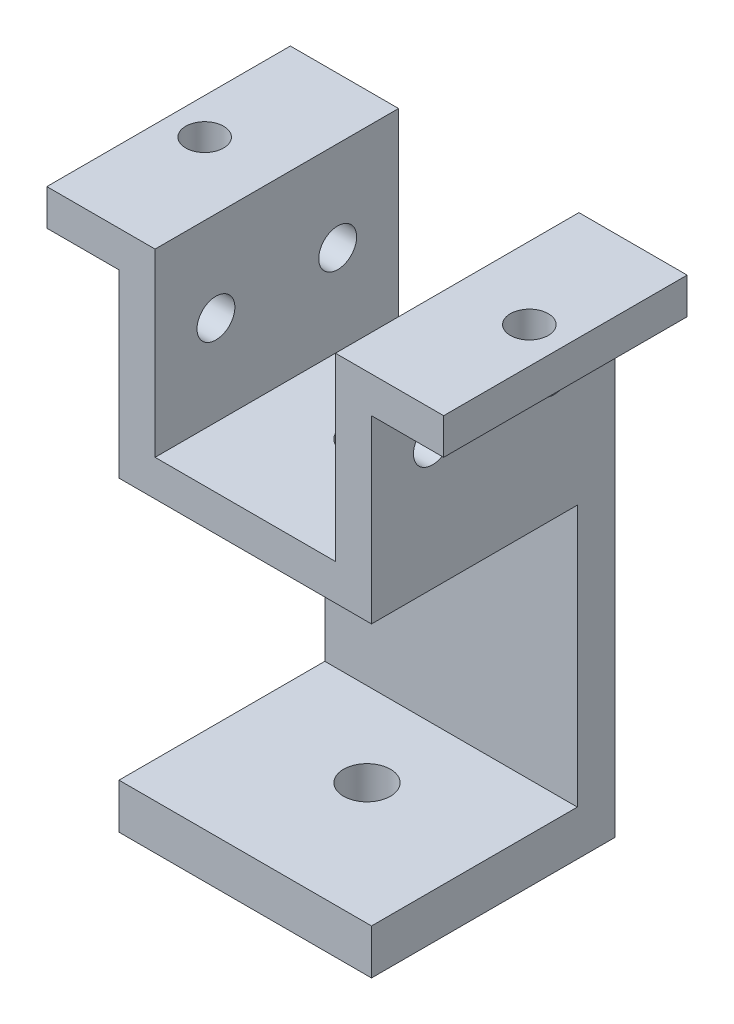
ISO-10303-21;
HEADER;
FILE_DESCRIPTION(('STEP AP214'),'2;1');
FILE_NAME('part.step','',(''),(''),'','','');
FILE_SCHEMA(('AUTOMOTIVE_DESIGN { 1 0 10303 214 1 1 1 1 }'));
ENDSEC;
DATA;
#1=APPLICATION_CONTEXT('core data for automotive mechanical design processes');
#2=APPLICATION_PROTOCOL_DEFINITION('international standard','automotive_design',2000,#1);
#3=PRODUCT_CONTEXT('',#1,'mechanical');
#4=PRODUCT('Part','Part','',(#3));
#5=PRODUCT_RELATED_PRODUCT_CATEGORY('part','',(#4));
#6=PRODUCT_DEFINITION_FORMATION('','',#4);
#7=PRODUCT_DEFINITION_CONTEXT('part definition',#1,'design');
#8=PRODUCT_DEFINITION('design','',#6,#7);
#9=PRODUCT_DEFINITION_SHAPE('','',#8);
#10=(LENGTH_UNIT() NAMED_UNIT(*) SI_UNIT(.MILLI.,.METRE.));
#11=(NAMED_UNIT(*) PLANE_ANGLE_UNIT() SI_UNIT($,.RADIAN.));
#12=(NAMED_UNIT(*) SI_UNIT($,.STERADIAN.) SOLID_ANGLE_UNIT());
#13=UNCERTAINTY_MEASURE_WITH_UNIT(LENGTH_MEASURE(1.E-05),#10,'distance_accuracy_value','');
#14=(GEOMETRIC_REPRESENTATION_CONTEXT(3) GLOBAL_UNCERTAINTY_ASSIGNED_CONTEXT((#13)) GLOBAL_UNIT_ASSIGNED_CONTEXT((#10,
#11,#12)) REPRESENTATION_CONTEXT('',''));
#15=CARTESIAN_POINT('',(0.,0.,0.));
#16=DIRECTION('',(0.,0.,1.));
#17=DIRECTION('',(1.,0.,0.));
#18=AXIS2_PLACEMENT_3D('',#15,#16,#17);
#19=CARTESIAN_POINT('',(-14.,-34.,4.17667107547479));
#20=DIRECTION('',(0.,0.,-1.));
#21=DIRECTION('',(-1.,0.,0.));
#22=AXIS2_PLACEMENT_3D('',#19,#20,#21);
#23=PLANE('',#22);
#24=DIRECTION('',(-1.,0.,0.));
#25=VECTOR('',#24,1.);
#26=CARTESIAN_POINT('',(-14.,-29.,4.17667107547479));
#27=LINE('',#26,#25);
#28=CARTESIAN_POINT('',(14.,-29.,4.17667107547479));
#29=VERTEX_POINT('',#28);
#30=CARTESIAN_POINT('',(-14.,-29.,4.17667107547479));
#31=VERTEX_POINT('',#30);
#32=EDGE_CURVE('E601',#29,#31,#27,.T.);
#33=ORIENTED_EDGE('',*,*,#32,.F.);
#34=DIRECTION('',(0.,1.,0.));
#35=VECTOR('',#34,1.);
#36=CARTESIAN_POINT('',(14.,-34.,4.17667107547479));
#37=LINE('',#36,#35);
#38=CARTESIAN_POINT('',(14.,0.,4.17667107547479));
#39=VERTEX_POINT('',#38);
#40=EDGE_CURVE('E51',#29,#39,#37,.T.);
#41=ORIENTED_EDGE('',*,*,#40,.T.);
#42=DIRECTION('',(-1.,0.,0.));
#43=VECTOR('',#42,1.);
#44=CARTESIAN_POINT('',(-14.,0.,4.17667107547479));
#45=LINE('',#44,#43);
#46=CARTESIAN_POINT('',(-14.,0.,4.17667107547479));
#47=VERTEX_POINT('',#46);
#48=EDGE_CURVE('E265',#39,#47,#45,.T.);
#49=ORIENTED_EDGE('',*,*,#48,.T.);
#50=DIRECTION('',(0.,1.,0.));
#51=VECTOR('',#50,1.);
#52=CARTESIAN_POINT('',(-14.,-34.,4.17667107547479));
#53=LINE('',#52,#51);
#54=EDGE_CURVE('E307',#31,#47,#53,.T.);
#55=ORIENTED_EDGE('',*,*,#54,.F.);
#56=EDGE_LOOP('',(#33,#41,#49,#55));
#57=FACE_BOUND('',#56,.T.);
#58=ADVANCED_FACE('F34',(#57),#23,.F.);
#59=CARTESIAN_POINT('',(-14.,0.,27.));
#60=DIRECTION('',(0.,1.,0.));
#61=DIRECTION('',(0.,0.,1.));
#62=AXIS2_PLACEMENT_3D('',#59,#60,#61);
#63=PLANE('',#62);
#64=CARTESIAN_POINT('',(0.,0.,13.5));
#65=DIRECTION('',(0.,1.,0.));
#66=DIRECTION('',(0.,0.,1.));
#67=AXIS2_PLACEMENT_3D('',#64,#65,#66);
#68=CIRCLE('',#67,2.6);
#69=CARTESIAN_POINT('',(0.,0.,10.9));
#70=VERTEX_POINT('',#69);
#71=EDGE_CURVE('E592',#70,#70,#68,.T.);
#72=ORIENTED_EDGE('',*,*,#71,.T.);
#73=EDGE_LOOP('',(#72));
#74=FACE_BOUND('',#73,.T.);
#75=ORIENTED_EDGE('',*,*,#48,.F.);
#76=DIRECTION('',(0.,0.,-1.));
#77=VECTOR('',#76,1.);
#78=CARTESIAN_POINT('',(14.,0.,27.));
#79=LINE('',#78,#77);
#80=CARTESIAN_POINT('',(14.,0.,27.));
#81=VERTEX_POINT('',#80);
#82=EDGE_CURVE('E43',#81,#39,#79,.T.);
#83=ORIENTED_EDGE('',*,*,#82,.F.);
#84=DIRECTION('',(1.,0.,0.));
#85=VECTOR('',#84,1.);
#86=CARTESIAN_POINT('',(-14.,0.,27.));
#87=LINE('',#86,#85);
#88=CARTESIAN_POINT('',(-14.,0.,27.));
#89=VERTEX_POINT('',#88);
#90=EDGE_CURVE('E107',#89,#81,#87,.T.);
#91=ORIENTED_EDGE('',*,*,#90,.F.);
#92=DIRECTION('',(0.,0.,-1.));
#93=VECTOR('',#92,1.);
#94=CARTESIAN_POINT('',(-14.,0.,27.));
#95=LINE('',#94,#93);
#96=EDGE_CURVE('E11',#89,#47,#95,.T.);
#97=ORIENTED_EDGE('',*,*,#96,.T.);
#98=EDGE_LOOP('',(#75,#83,#91,#97));
#99=FACE_BOUND('',#98,.T.);
#100=ADVANCED_FACE('F264',(#74,#99),#63,.F.);
#101=CARTESIAN_POINT('',(-14.,20.,27.));
#102=DIRECTION('',(1.,0.,0.));
#103=DIRECTION('',(0.,1.,0.));
#104=AXIS2_PLACEMENT_3D('',#101,#102,#103);
#105=PLANE('',#104);
#106=CARTESIAN_POINT('',(-14.,14.,6.75));
#107=DIRECTION('',(-1.,0.,0.));
#108=DIRECTION('',(0.,-1.,0.));
#109=AXIS2_PLACEMENT_3D('',#106,#107,#108);
#110=CIRCLE('',#109,2.1);
#111=CARTESIAN_POINT('',(-14.,11.9,6.75));
#112=VERTEX_POINT('',#111);
#113=EDGE_CURVE('E212',#112,#112,#110,.T.);
#114=ORIENTED_EDGE('',*,*,#113,.F.);
#115=EDGE_LOOP('',(#114));
#116=FACE_BOUND('',#115,.T.);
#117=CARTESIAN_POINT('',(-14.,14.,20.25));
#118=DIRECTION('',(-1.,0.,0.));
#119=DIRECTION('',(0.,-1.,0.));
#120=AXIS2_PLACEMENT_3D('',#117,#118,#119);
#121=CIRCLE('',#120,2.1);
#122=CARTESIAN_POINT('',(-14.,11.9,20.25));
#123=VERTEX_POINT('',#122);
#124=EDGE_CURVE('E318',#123,#123,#121,.T.);
#125=ORIENTED_EDGE('',*,*,#124,.F.);
#126=EDGE_LOOP('',(#125));
#127=FACE_BOUND('',#126,.T.);
#128=DIRECTION('',(0.,-1.,0.));
#129=VECTOR('',#128,1.);
#130=CARTESIAN_POINT('',(-14.,20.,0.));
#131=LINE('',#130,#129);
#132=CARTESIAN_POINT('',(-14.,20.,0.));
#133=VERTEX_POINT('',#132);
#134=CARTESIAN_POINT('',(-14.,-34.,0.));
#135=VERTEX_POINT('',#134);
#136=EDGE_CURVE('E163',#133,#135,#131,.T.);
#137=ORIENTED_EDGE('',*,*,#136,.T.);
#138=DIRECTION('',(0.,0.,-1.));
#139=VECTOR('',#138,1.);
#140=CARTESIAN_POINT('',(-14.,-34.,0.));
#141=LINE('',#140,#139);
#142=CARTESIAN_POINT('',(-14.,-34.,27.));
#143=VERTEX_POINT('',#142);
#144=EDGE_CURVE('E301',#143,#135,#141,.T.);
#145=ORIENTED_EDGE('',*,*,#144,.F.);
#146=DIRECTION('',(0.,-1.,0.));
#147=VECTOR('',#146,1.);
#148=CARTESIAN_POINT('',(-14.,-34.,27.));
#149=LINE('',#148,#147);
#150=CARTESIAN_POINT('',(-14.,-29.,27.));
#151=VERTEX_POINT('',#150);
#152=EDGE_CURVE('E608',#151,#143,#149,.T.);
#153=ORIENTED_EDGE('',*,*,#152,.F.);
#154=DIRECTION('',(0.,0.,-1.));
#155=VECTOR('',#154,1.);
#156=CARTESIAN_POINT('',(-14.,-29.,55.4429253066558));
#157=LINE('',#156,#155);
#158=EDGE_CURVE('E593',#151,#31,#157,.T.);
#159=ORIENTED_EDGE('',*,*,#158,.T.);
#160=ORIENTED_EDGE('',*,*,#54,.T.);
#161=ORIENTED_EDGE('',*,*,#96,.F.);
#162=DIRECTION('',(0.,-1.,0.));
#163=VECTOR('',#162,1.);
#164=CARTESIAN_POINT('',(-14.,20.,27.));
#165=LINE('',#164,#163);
#166=CARTESIAN_POINT('',(-14.,20.,27.));
#167=VERTEX_POINT('',#166);
#168=EDGE_CURVE('E185',#167,#89,#165,.T.);
#169=ORIENTED_EDGE('',*,*,#168,.F.);
#170=DIRECTION('',(0.,0.,-1.));
#171=VECTOR('',#170,1.);
#172=CARTESIAN_POINT('',(-14.,20.,27.));
#173=LINE('',#172,#171);
#174=EDGE_CURVE('E159',#167,#133,#173,.T.);
#175=ORIENTED_EDGE('',*,*,#174,.T.);
#176=EDGE_LOOP('',(#137,#145,#153,#159,#160,#161,#169,#175));
#177=FACE_BOUND('',#176,.T.);
#178=ADVANCED_FACE('F36',(#116,#127,#177),#105,.F.);
#179=CARTESIAN_POINT('',(14.,0.,27.));
#180=DIRECTION('',(-1.,0.,0.));
#181=DIRECTION('',(0.,-1.,0.));
#182=AXIS2_PLACEMENT_3D('',#179,#180,#181);
#183=PLANE('',#182);
#184=CARTESIAN_POINT('',(14.,14.,6.75));
#185=DIRECTION('',(-1.,0.,0.));
#186=DIRECTION('',(0.,-1.,0.));
#187=AXIS2_PLACEMENT_3D('',#184,#185,#186);
#188=CIRCLE('',#187,2.1);
#189=CARTESIAN_POINT('',(14.,11.9,6.75));
#190=VERTEX_POINT('',#189);
#191=EDGE_CURVE('E167',#190,#190,#188,.T.);
#192=ORIENTED_EDGE('',*,*,#191,.T.);
#193=EDGE_LOOP('',(#192));
#194=FACE_BOUND('',#193,.T.);
#195=CARTESIAN_POINT('',(14.,14.,20.25));
#196=DIRECTION('',(-1.,0.,0.));
#197=DIRECTION('',(0.,-1.,0.));
#198=AXIS2_PLACEMENT_3D('',#195,#196,#197);
#199=CIRCLE('',#198,2.1);
#200=CARTESIAN_POINT('',(14.,11.9,20.25));
#201=VERTEX_POINT('',#200);
#202=EDGE_CURVE('E216',#201,#201,#199,.T.);
#203=ORIENTED_EDGE('',*,*,#202,.T.);
#204=EDGE_LOOP('',(#203));
#205=FACE_BOUND('',#204,.T.);
#206=DIRECTION('',(0.,1.,0.));
#207=VECTOR('',#206,1.);
#208=CARTESIAN_POINT('',(14.,0.,0.));
#209=LINE('',#208,#207);
#210=CARTESIAN_POINT('',(14.,-34.,0.));
#211=VERTEX_POINT('',#210);
#212=CARTESIAN_POINT('',(14.,20.,0.));
#213=VERTEX_POINT('',#212);
#214=EDGE_CURVE('E166',#211,#213,#209,.T.);
#215=ORIENTED_EDGE('',*,*,#214,.T.);
#216=DIRECTION('',(0.,0.,-1.));
#217=VECTOR('',#216,1.);
#218=CARTESIAN_POINT('',(14.,20.,27.));
#219=LINE('',#218,#217);
#220=CARTESIAN_POINT('',(14.,20.,27.));
#221=VERTEX_POINT('',#220);
#222=EDGE_CURVE('E204',#221,#213,#219,.T.);
#223=ORIENTED_EDGE('',*,*,#222,.F.);
#224=DIRECTION('',(0.,1.,0.));
#225=VECTOR('',#224,1.);
#226=CARTESIAN_POINT('',(14.,0.,27.));
#227=LINE('',#226,#225);
#228=EDGE_CURVE('E233',#81,#221,#227,.T.);
#229=ORIENTED_EDGE('',*,*,#228,.F.);
#230=ORIENTED_EDGE('',*,*,#82,.T.);
#231=ORIENTED_EDGE('',*,*,#40,.F.);
#232=DIRECTION('',(0.,0.,-1.));
#233=VECTOR('',#232,1.);
#234=CARTESIAN_POINT('',(14.,-29.,55.4429253066558));
#235=LINE('',#234,#233);
#236=CARTESIAN_POINT('',(14.,-29.,27.));
#237=VERTEX_POINT('',#236);
#238=EDGE_CURVE('E596',#237,#29,#235,.T.);
#239=ORIENTED_EDGE('',*,*,#238,.F.);
#240=DIRECTION('',(0.,1.,0.));
#241=VECTOR('',#240,1.);
#242=CARTESIAN_POINT('',(14.,-34.,27.));
#243=LINE('',#242,#241);
#244=CARTESIAN_POINT('',(14.,-34.,27.));
#245=VERTEX_POINT('',#244);
#246=EDGE_CURVE('E305',#245,#237,#243,.T.);
#247=ORIENTED_EDGE('',*,*,#246,.F.);
#248=DIRECTION('',(0.,0.,1.));
#249=VECTOR('',#248,1.);
#250=CARTESIAN_POINT('',(14.,-34.,0.));
#251=LINE('',#250,#249);
#252=EDGE_CURVE('E298',#211,#245,#251,.T.);
#253=ORIENTED_EDGE('',*,*,#252,.F.);
#254=EDGE_LOOP('',(#215,#223,#229,#230,#231,#239,#247,#253));
#255=FACE_BOUND('',#254,.T.);
#256=ADVANCED_FACE('F267',(#194,#205,#255),#183,.F.);
#257=CARTESIAN_POINT('',(14.,20.,27.));
#258=DIRECTION('',(0.,1.,0.));
#259=DIRECTION('',(0.,0.,1.));
#260=AXIS2_PLACEMENT_3D('',#257,#258,#259);
#261=PLANE('',#260);
#262=CARTESIAN_POINT('',(18.,20.,13.5));
#263=DIRECTION('',(0.,-1.,0.));
#264=DIRECTION('',(0.,0.,-1.));
#265=AXIS2_PLACEMENT_3D('',#262,#263,#264);
#266=CIRCLE('',#265,2.1);
#267=CARTESIAN_POINT('',(18.,20.,11.4));
#268=VERTEX_POINT('',#267);
#269=EDGE_CURVE('E314',#268,#268,#266,.T.);
#270=ORIENTED_EDGE('',*,*,#269,.F.);
#271=EDGE_LOOP('',(#270));
#272=FACE_BOUND('',#271,.T.);
#273=DIRECTION('',(1.,0.,0.));
#274=VECTOR('',#273,1.);
#275=CARTESIAN_POINT('',(14.,20.,0.));
#276=LINE('',#275,#274);
#277=CARTESIAN_POINT('',(22.,20.,0.));
#278=VERTEX_POINT('',#277);
#279=EDGE_CURVE('E169',#213,#278,#276,.T.);
#280=ORIENTED_EDGE('',*,*,#279,.T.);
#281=DIRECTION('',(0.,0.,-1.));
#282=VECTOR('',#281,1.);
#283=CARTESIAN_POINT('',(22.,20.,27.));
#284=LINE('',#283,#282);
#285=CARTESIAN_POINT('',(22.,20.,27.));
#286=VERTEX_POINT('',#285);
#287=EDGE_CURVE('E201',#286,#278,#284,.T.);
#288=ORIENTED_EDGE('',*,*,#287,.F.);
#289=DIRECTION('',(1.,0.,0.));
#290=VECTOR('',#289,1.);
#291=CARTESIAN_POINT('',(14.,20.,27.));
#292=LINE('',#291,#290);
#293=EDGE_CURVE('E235',#221,#286,#292,.T.);
#294=ORIENTED_EDGE('',*,*,#293,.F.);
#295=ORIENTED_EDGE('',*,*,#222,.T.);
#296=EDGE_LOOP('',(#280,#288,#294,#295));
#297=FACE_BOUND('',#296,.T.);
#298=ADVANCED_FACE('F274',(#272,#297),#261,.F.);
#299=CARTESIAN_POINT('',(22.,20.,27.));
#300=DIRECTION('',(-1.,0.,0.));
#301=DIRECTION('',(0.,0.,1.));
#302=AXIS2_PLACEMENT_3D('',#299,#300,#301);
#303=PLANE('',#302);
#304=DIRECTION('',(0.,1.,0.));
#305=VECTOR('',#304,1.);
#306=CARTESIAN_POINT('',(22.,20.,0.));
#307=LINE('',#306,#305);
#308=CARTESIAN_POINT('',(22.,24.,0.));
#309=VERTEX_POINT('',#308);
#310=EDGE_CURVE('E171',#278,#309,#307,.T.);
#311=ORIENTED_EDGE('',*,*,#310,.T.);
#312=DIRECTION('',(0.,0.,-1.));
#313=VECTOR('',#312,1.);
#314=CARTESIAN_POINT('',(22.,24.,27.));
#315=LINE('',#314,#313);
#316=CARTESIAN_POINT('',(22.,24.,27.));
#317=VERTEX_POINT('',#316);
#318=EDGE_CURVE('E198',#317,#309,#315,.T.);
#319=ORIENTED_EDGE('',*,*,#318,.F.);
#320=DIRECTION('',(0.,1.,0.));
#321=VECTOR('',#320,1.);
#322=CARTESIAN_POINT('',(22.,20.,27.));
#323=LINE('',#322,#321);
#324=EDGE_CURVE('E237',#286,#317,#323,.T.);
#325=ORIENTED_EDGE('',*,*,#324,.F.);
#326=ORIENTED_EDGE('',*,*,#287,.T.);
#327=EDGE_LOOP('',(#311,#319,#325,#326));
#328=FACE_BOUND('',#327,.T.);
#329=ADVANCED_FACE('F280',(#328),#303,.F.);
#330=CARTESIAN_POINT('',(22.,24.,27.));
#331=DIRECTION('',(0.,-1.,0.));
#332=DIRECTION('',(0.,0.,-1.));
#333=AXIS2_PLACEMENT_3D('',#330,#331,#332);
#334=PLANE('',#333);
#335=CARTESIAN_POINT('',(18.,24.,13.5));
#336=DIRECTION('',(0.,-1.,0.));
#337=DIRECTION('',(0.,0.,-1.));
#338=AXIS2_PLACEMENT_3D('',#335,#336,#337);
#339=CIRCLE('',#338,2.1);
#340=CARTESIAN_POINT('',(18.,24.,11.4));
#341=VERTEX_POINT('',#340);
#342=EDGE_CURVE('E322',#341,#341,#339,.T.);
#343=ORIENTED_EDGE('',*,*,#342,.T.);
#344=EDGE_LOOP('',(#343));
#345=FACE_BOUND('',#344,.T.);
#346=DIRECTION('',(-1.,0.,0.));
#347=VECTOR('',#346,1.);
#348=CARTESIAN_POINT('',(22.,24.,0.));
#349=LINE('',#348,#347);
#350=CARTESIAN_POINT('',(10.,24.,0.));
#351=VERTEX_POINT('',#350);
#352=EDGE_CURVE('E173',#309,#351,#349,.T.);
#353=ORIENTED_EDGE('',*,*,#352,.T.);
#354=DIRECTION('',(0.,0.,-1.));
#355=VECTOR('',#354,1.);
#356=CARTESIAN_POINT('',(10.,24.,27.));
#357=LINE('',#356,#355);
#358=CARTESIAN_POINT('',(10.,24.,27.));
#359=VERTEX_POINT('',#358);
#360=EDGE_CURVE('E195',#359,#351,#357,.T.);
#361=ORIENTED_EDGE('',*,*,#360,.F.);
#362=DIRECTION('',(-1.,0.,0.));
#363=VECTOR('',#362,1.);
#364=CARTESIAN_POINT('',(22.,24.,27.));
#365=LINE('',#364,#363);
#366=EDGE_CURVE('E239',#317,#359,#365,.T.);
#367=ORIENTED_EDGE('',*,*,#366,.F.);
#368=ORIENTED_EDGE('',*,*,#318,.T.);
#369=EDGE_LOOP('',(#353,#361,#367,#368));
#370=FACE_BOUND('',#369,.T.);
#371=ADVANCED_FACE('F284',(#345,#370),#334,.F.);
#372=CARTESIAN_POINT('',(10.,24.,27.));
#373=DIRECTION('',(1.,0.,0.));
#374=DIRECTION('',(0.,1.,0.));
#375=AXIS2_PLACEMENT_3D('',#372,#373,#374);
#376=PLANE('',#375);
#377=CARTESIAN_POINT('',(10.,14.,6.75));
#378=DIRECTION('',(1.,0.,0.));
#379=DIRECTION('',(0.,1.,0.));
#380=AXIS2_PLACEMENT_3D('',#377,#378,#379);
#381=CIRCLE('',#380,2.1);
#382=CARTESIAN_POINT('',(10.,16.1,6.75));
#383=VERTEX_POINT('',#382);
#384=EDGE_CURVE('E215',#383,#383,#381,.T.);
#385=ORIENTED_EDGE('',*,*,#384,.T.);
#386=EDGE_LOOP('',(#385));
#387=FACE_BOUND('',#386,.T.);
#388=CARTESIAN_POINT('',(10.,14.,20.25));
#389=DIRECTION('',(1.,0.,0.));
#390=DIRECTION('',(0.,1.,0.));
#391=AXIS2_PLACEMENT_3D('',#388,#389,#390);
#392=CIRCLE('',#391,2.1);
#393=CARTESIAN_POINT('',(10.,16.1,20.25));
#394=VERTEX_POINT('',#393);
#395=EDGE_CURVE('E211',#394,#394,#392,.T.);
#396=ORIENTED_EDGE('',*,*,#395,.T.);
#397=EDGE_LOOP('',(#396));
#398=FACE_BOUND('',#397,.T.);
#399=DIRECTION('',(0.,-1.,0.));
#400=VECTOR('',#399,1.);
#401=CARTESIAN_POINT('',(10.,24.,0.));
#402=LINE('',#401,#400);
#403=CARTESIAN_POINT('',(10.,4.,0.));
#404=VERTEX_POINT('',#403);
#405=EDGE_CURVE('E175',#351,#404,#402,.T.);
#406=ORIENTED_EDGE('',*,*,#405,.T.);
#407=DIRECTION('',(0.,0.,-1.));
#408=VECTOR('',#407,1.);
#409=CARTESIAN_POINT('',(10.,4.,27.));
#410=LINE('',#409,#408);
#411=CARTESIAN_POINT('',(10.,4.,27.));
#412=VERTEX_POINT('',#411);
#413=EDGE_CURVE('E192',#412,#404,#410,.T.);
#414=ORIENTED_EDGE('',*,*,#413,.F.);
#415=DIRECTION('',(0.,-1.,0.));
#416=VECTOR('',#415,1.);
#417=CARTESIAN_POINT('',(10.,24.,27.));
#418=LINE('',#417,#416);
#419=EDGE_CURVE('E241',#359,#412,#418,.T.);
#420=ORIENTED_EDGE('',*,*,#419,.F.);
#421=ORIENTED_EDGE('',*,*,#360,.T.);
#422=EDGE_LOOP('',(#406,#414,#420,#421));
#423=FACE_BOUND('',#422,.T.);
#424=ADVANCED_FACE('F287',(#387,#398,#423),#376,.F.);
#425=CARTESIAN_POINT('',(10.,4.,27.));
#426=DIRECTION('',(0.,-1.,0.));
#427=DIRECTION('',(1.,0.,0.));
#428=AXIS2_PLACEMENT_3D('',#425,#426,#427);
#429=PLANE('',#428);
#430=CARTESIAN_POINT('',(0.,4.,13.5));
#431=DIRECTION('',(0.,-1.,0.));
#432=DIRECTION('',(1.,0.,0.));
#433=AXIS2_PLACEMENT_3D('',#430,#431,#432);
#434=CIRCLE('',#433,2.6);
#435=CARTESIAN_POINT('',(0.,4.,10.9));
#436=VERTEX_POINT('',#435);
#437=EDGE_CURVE('E589',#436,#436,#434,.T.);
#438=ORIENTED_EDGE('',*,*,#437,.T.);
#439=EDGE_LOOP('',(#438));
#440=FACE_BOUND('',#439,.T.);
#441=DIRECTION('',(-1.,0.,0.));
#442=VECTOR('',#441,1.);
#443=CARTESIAN_POINT('',(10.,4.,0.));
#444=LINE('',#443,#442);
#445=CARTESIAN_POINT('',(-10.,4.,0.));
#446=VERTEX_POINT('',#445);
#447=EDGE_CURVE('E177',#404,#446,#444,.T.);
#448=ORIENTED_EDGE('',*,*,#447,.T.);
#449=DIRECTION('',(0.,0.,-1.));
#450=VECTOR('',#449,1.);
#451=CARTESIAN_POINT('',(-10.,4.,27.));
#452=LINE('',#451,#450);
#453=CARTESIAN_POINT('',(-10.,4.,27.));
#454=VERTEX_POINT('',#453);
#455=EDGE_CURVE('E189',#454,#446,#452,.T.);
#456=ORIENTED_EDGE('',*,*,#455,.F.);
#457=DIRECTION('',(-1.,0.,0.));
#458=VECTOR('',#457,1.);
#459=CARTESIAN_POINT('',(10.,4.,27.));
#460=LINE('',#459,#458);
#461=EDGE_CURVE('E243',#412,#454,#460,.T.);
#462=ORIENTED_EDGE('',*,*,#461,.F.);
#463=ORIENTED_EDGE('',*,*,#413,.T.);
#464=EDGE_LOOP('',(#448,#456,#462,#463));
#465=FACE_BOUND('',#464,.T.);
#466=ADVANCED_FACE('F249',(#440,#465),#429,.F.);
#467=CARTESIAN_POINT('',(-10.,4.,27.));
#468=DIRECTION('',(-1.,0.,0.));
#469=DIRECTION('',(0.,0.,1.));
#470=AXIS2_PLACEMENT_3D('',#467,#468,#469);
#471=PLANE('',#470);
#472=CARTESIAN_POINT('',(-10.,14.,6.75));
#473=DIRECTION('',(-1.,0.,0.));
#474=DIRECTION('',(0.,0.,1.));
#475=AXIS2_PLACEMENT_3D('',#472,#473,#474);
#476=CIRCLE('',#475,2.1);
#477=CARTESIAN_POINT('',(-10.,14.,8.85));
#478=VERTEX_POINT('',#477);
#479=EDGE_CURVE('E213',#478,#478,#476,.T.);
#480=ORIENTED_EDGE('',*,*,#479,.T.);
#481=EDGE_LOOP('',(#480));
#482=FACE_BOUND('',#481,.T.);
#483=CARTESIAN_POINT('',(-10.,14.,20.25));
#484=DIRECTION('',(-1.,0.,0.));
#485=DIRECTION('',(0.,0.,1.));
#486=AXIS2_PLACEMENT_3D('',#483,#484,#485);
#487=CIRCLE('',#486,2.1);
#488=CARTESIAN_POINT('',(-10.,14.,22.35));
#489=VERTEX_POINT('',#488);
#490=EDGE_CURVE('E209',#489,#489,#487,.T.);
#491=ORIENTED_EDGE('',*,*,#490,.T.);
#492=EDGE_LOOP('',(#491));
#493=FACE_BOUND('',#492,.T.);
#494=DIRECTION('',(0.,1.,0.));
#495=VECTOR('',#494,1.);
#496=CARTESIAN_POINT('',(-10.,4.,0.));
#497=LINE('',#496,#495);
#498=CARTESIAN_POINT('',(-10.,24.,0.));
#499=VERTEX_POINT('',#498);
#500=EDGE_CURVE('E179',#446,#499,#497,.T.);
#501=ORIENTED_EDGE('',*,*,#500,.T.);
#502=DIRECTION('',(0.,0.,-1.));
#503=VECTOR('',#502,1.);
#504=CARTESIAN_POINT('',(-10.,24.,27.));
#505=LINE('',#504,#503);
#506=CARTESIAN_POINT('',(-10.,24.,27.));
#507=VERTEX_POINT('',#506);
#508=EDGE_CURVE('E154',#507,#499,#505,.T.);
#509=ORIENTED_EDGE('',*,*,#508,.F.);
#510=DIRECTION('',(0.,1.,0.));
#511=VECTOR('',#510,1.);
#512=CARTESIAN_POINT('',(-10.,4.,27.));
#513=LINE('',#512,#511);
#514=EDGE_CURVE('E142',#454,#507,#513,.T.);
#515=ORIENTED_EDGE('',*,*,#514,.F.);
#516=ORIENTED_EDGE('',*,*,#455,.T.);
#517=EDGE_LOOP('',(#501,#509,#515,#516));
#518=FACE_BOUND('',#517,.T.);
#519=ADVANCED_FACE('F253',(#482,#493,#518),#471,.F.);
#520=CARTESIAN_POINT('',(-10.,24.,27.));
#521=DIRECTION('',(0.,-1.,0.));
#522=DIRECTION('',(0.,0.,-1.));
#523=AXIS2_PLACEMENT_3D('',#520,#521,#522);
#524=PLANE('',#523);
#525=CARTESIAN_POINT('',(-18.,24.,13.5));
#526=DIRECTION('',(0.,-1.,0.));
#527=DIRECTION('',(0.,0.,-1.));
#528=AXIS2_PLACEMENT_3D('',#525,#526,#527);
#529=CIRCLE('',#528,2.1);
#530=CARTESIAN_POINT('',(-18.,24.,11.4));
#531=VERTEX_POINT('',#530);
#532=EDGE_CURVE('E315',#531,#531,#529,.T.);
#533=ORIENTED_EDGE('',*,*,#532,.T.);
#534=EDGE_LOOP('',(#533));
#535=FACE_BOUND('',#534,.T.);
#536=DIRECTION('',(-1.,0.,0.));
#537=VECTOR('',#536,1.);
#538=CARTESIAN_POINT('',(-10.,24.,0.));
#539=LINE('',#538,#537);
#540=CARTESIAN_POINT('',(-22.,24.,0.));
#541=VERTEX_POINT('',#540);
#542=EDGE_CURVE('E151',#499,#541,#539,.T.);
#543=ORIENTED_EDGE('',*,*,#542,.T.);
#544=DIRECTION('',(0.,0.,-1.));
#545=VECTOR('',#544,1.);
#546=CARTESIAN_POINT('',(-22.,24.,27.));
#547=LINE('',#546,#545);
#548=CARTESIAN_POINT('',(-22.,24.,27.));
#549=VERTEX_POINT('',#548);
#550=EDGE_CURVE('E148',#549,#541,#547,.T.);
#551=ORIENTED_EDGE('',*,*,#550,.F.);
#552=DIRECTION('',(-1.,0.,0.));
#553=VECTOR('',#552,1.);
#554=CARTESIAN_POINT('',(-10.,24.,27.));
#555=LINE('',#554,#553);
#556=EDGE_CURVE('E135',#507,#549,#555,.T.);
#557=ORIENTED_EDGE('',*,*,#556,.F.);
#558=ORIENTED_EDGE('',*,*,#508,.T.);
#559=EDGE_LOOP('',(#543,#551,#557,#558));
#560=FACE_BOUND('',#559,.T.);
#561=ADVANCED_FACE('F149',(#535,#560),#524,.F.);
#562=CARTESIAN_POINT('',(-22.,24.,27.));
#563=DIRECTION('',(1.,0.,0.));
#564=DIRECTION('',(0.,0.,-1.));
#565=AXIS2_PLACEMENT_3D('',#562,#563,#564);
#566=PLANE('',#565);
#567=DIRECTION('',(0.,-1.,0.));
#568=VECTOR('',#567,1.);
#569=CARTESIAN_POINT('',(-22.,24.,0.));
#570=LINE('',#569,#568);
#571=CARTESIAN_POINT('',(-22.,20.,0.));
#572=VERTEX_POINT('',#571);
#573=EDGE_CURVE('E182',#541,#572,#570,.T.);
#574=ORIENTED_EDGE('',*,*,#573,.T.);
#575=DIRECTION('',(0.,0.,-1.));
#576=VECTOR('',#575,1.);
#577=CARTESIAN_POINT('',(-22.,20.,27.));
#578=LINE('',#577,#576);
#579=CARTESIAN_POINT('',(-22.,20.,27.));
#580=VERTEX_POINT('',#579);
#581=EDGE_CURVE('E155',#580,#572,#578,.T.);
#582=ORIENTED_EDGE('',*,*,#581,.F.);
#583=DIRECTION('',(0.,-1.,0.));
#584=VECTOR('',#583,1.);
#585=CARTESIAN_POINT('',(-22.,24.,27.));
#586=LINE('',#585,#584);
#587=EDGE_CURVE('E139',#549,#580,#586,.T.);
#588=ORIENTED_EDGE('',*,*,#587,.F.);
#589=ORIENTED_EDGE('',*,*,#550,.T.);
#590=EDGE_LOOP('',(#574,#582,#588,#589));
#591=FACE_BOUND('',#590,.T.);
#592=ADVANCED_FACE('F157',(#591),#566,.F.);
#593=CARTESIAN_POINT('',(-22.,20.,27.));
#594=DIRECTION('',(0.,1.,0.));
#595=DIRECTION('',(0.,0.,1.));
#596=AXIS2_PLACEMENT_3D('',#593,#594,#595);
#597=PLANE('',#596);
#598=CARTESIAN_POINT('',(-18.,20.,13.5));
#599=DIRECTION('',(0.,-1.,0.));
#600=DIRECTION('',(0.,0.,-1.));
#601=AXIS2_PLACEMENT_3D('',#598,#599,#600);
#602=CIRCLE('',#601,2.1);
#603=CARTESIAN_POINT('',(-18.,20.,11.4));
#604=VERTEX_POINT('',#603);
#605=EDGE_CURVE('E319',#604,#604,#602,.T.);
#606=ORIENTED_EDGE('',*,*,#605,.F.);
#607=EDGE_LOOP('',(#606));
#608=FACE_BOUND('',#607,.T.);
#609=DIRECTION('',(1.,0.,0.));
#610=VECTOR('',#609,1.);
#611=CARTESIAN_POINT('',(-22.,20.,0.));
#612=LINE('',#611,#610);
#613=EDGE_CURVE('E99',#572,#133,#612,.T.);
#614=ORIENTED_EDGE('',*,*,#613,.T.);
#615=ORIENTED_EDGE('',*,*,#174,.F.);
#616=DIRECTION('',(1.,0.,0.));
#617=VECTOR('',#616,1.);
#618=CARTESIAN_POINT('',(-22.,20.,27.));
#619=LINE('',#618,#617);
#620=EDGE_CURVE('E60',#580,#167,#619,.T.);
#621=ORIENTED_EDGE('',*,*,#620,.F.);
#622=ORIENTED_EDGE('',*,*,#581,.T.);
#623=EDGE_LOOP('',(#614,#615,#621,#622));
#624=FACE_BOUND('',#623,.T.);
#625=ADVANCED_FACE('F257',(#608,#624),#597,.F.);
#626=CARTESIAN_POINT('',(0.,0.,27.));
#627=DIRECTION('',(0.,0.,1.));
#628=DIRECTION('',(1.,0.,0.));
#629=AXIS2_PLACEMENT_3D('',#626,#627,#628);
#630=PLANE('',#629);
#631=ORIENTED_EDGE('',*,*,#168,.T.);
#632=ORIENTED_EDGE('',*,*,#90,.T.);
#633=ORIENTED_EDGE('',*,*,#228,.T.);
#634=ORIENTED_EDGE('',*,*,#293,.T.);
#635=ORIENTED_EDGE('',*,*,#324,.T.);
#636=ORIENTED_EDGE('',*,*,#366,.T.);
#637=ORIENTED_EDGE('',*,*,#419,.T.);
#638=ORIENTED_EDGE('',*,*,#461,.T.);
#639=ORIENTED_EDGE('',*,*,#514,.T.);
#640=ORIENTED_EDGE('',*,*,#556,.T.);
#641=ORIENTED_EDGE('',*,*,#587,.T.);
#642=ORIENTED_EDGE('',*,*,#620,.T.);
#643=EDGE_LOOP('',(#631,#632,#633,#634,#635,#636,#637,#638,#639,#640,#641,#642));
#644=FACE_BOUND('',#643,.T.);
#645=ADVANCED_FACE('F137',(#644),#630,.T.);
#646=CARTESIAN_POINT('',(0.,0.,0.));
#647=DIRECTION('',(0.,0.,1.));
#648=DIRECTION('',(1.,0.,0.));
#649=AXIS2_PLACEMENT_3D('',#646,#647,#648);
#650=PLANE('',#649);
#651=ORIENTED_EDGE('',*,*,#136,.F.);
#652=ORIENTED_EDGE('',*,*,#613,.F.);
#653=ORIENTED_EDGE('',*,*,#573,.F.);
#654=ORIENTED_EDGE('',*,*,#542,.F.);
#655=ORIENTED_EDGE('',*,*,#500,.F.);
#656=ORIENTED_EDGE('',*,*,#447,.F.);
#657=ORIENTED_EDGE('',*,*,#405,.F.);
#658=ORIENTED_EDGE('',*,*,#352,.F.);
#659=ORIENTED_EDGE('',*,*,#310,.F.);
#660=ORIENTED_EDGE('',*,*,#279,.F.);
#661=ORIENTED_EDGE('',*,*,#214,.F.);
#662=DIRECTION('',(1.,0.,0.));
#663=VECTOR('',#662,1.);
#664=CARTESIAN_POINT('',(-14.,-34.,0.));
#665=LINE('',#664,#663);
#666=EDGE_CURVE('E291',#135,#211,#665,.T.);
#667=ORIENTED_EDGE('',*,*,#666,.F.);
#668=EDGE_LOOP('',(#651,#652,#653,#654,#655,#656,#657,#658,#659,#660,#661,#667));
#669=FACE_BOUND('',#668,.T.);
#670=ADVANCED_FACE('F256',(#669),#650,.F.);
#671=CARTESIAN_POINT('',(22.,14.,20.25));
#672=DIRECTION('',(-1.,0.,0.));
#673=DIRECTION('',(0.,-1.,0.));
#674=AXIS2_PLACEMENT_3D('',#671,#672,#673);
#675=CYLINDRICAL_SURFACE('',#674,2.1);
#676=ORIENTED_EDGE('',*,*,#124,.T.);
#677=EDGE_LOOP('',(#676));
#678=FACE_BOUND('',#677,.T.);
#679=ORIENTED_EDGE('',*,*,#490,.F.);
#680=EDGE_LOOP('',(#679));
#681=FACE_BOUND('',#680,.T.);
#682=ADVANCED_FACE('F331',(#678,#681),#675,.F.);
#683=CARTESIAN_POINT('',(22.,14.,6.75));
#684=DIRECTION('',(-1.,0.,0.));
#685=DIRECTION('',(0.,-1.,0.));
#686=AXIS2_PLACEMENT_3D('',#683,#684,#685);
#687=CYLINDRICAL_SURFACE('',#686,2.1);
#688=ORIENTED_EDGE('',*,*,#113,.T.);
#689=EDGE_LOOP('',(#688));
#690=FACE_BOUND('',#689,.T.);
#691=ORIENTED_EDGE('',*,*,#479,.F.);
#692=EDGE_LOOP('',(#691));
#693=FACE_BOUND('',#692,.T.);
#694=ADVANCED_FACE('F364',(#690,#693),#687,.F.);
#695=ORIENTED_EDGE('',*,*,#395,.F.);
#696=EDGE_LOOP('',(#695));
#697=FACE_BOUND('',#696,.T.);
#698=ORIENTED_EDGE('',*,*,#202,.F.);
#699=EDGE_LOOP('',(#698));
#700=FACE_BOUND('',#699,.T.);
#701=ADVANCED_FACE('F362',(#697,#700),#675,.F.);
#702=ORIENTED_EDGE('',*,*,#384,.F.);
#703=EDGE_LOOP('',(#702));
#704=FACE_BOUND('',#703,.T.);
#705=ORIENTED_EDGE('',*,*,#191,.F.);
#706=EDGE_LOOP('',(#705));
#707=FACE_BOUND('',#706,.T.);
#708=ADVANCED_FACE('F355',(#704,#707),#687,.F.);
#709=CARTESIAN_POINT('',(-18.,24.,13.5));
#710=DIRECTION('',(0.,-1.,0.));
#711=DIRECTION('',(0.,0.,-1.));
#712=AXIS2_PLACEMENT_3D('',#709,#710,#711);
#713=CYLINDRICAL_SURFACE('',#712,2.1);
#714=ORIENTED_EDGE('',*,*,#532,.F.);
#715=EDGE_LOOP('',(#714));
#716=FACE_BOUND('',#715,.T.);
#717=ORIENTED_EDGE('',*,*,#605,.T.);
#718=EDGE_LOOP('',(#717));
#719=FACE_BOUND('',#718,.T.);
#720=ADVANCED_FACE('F351',(#716,#719),#713,.F.);
#721=CARTESIAN_POINT('',(18.,24.,13.5));
#722=DIRECTION('',(0.,-1.,0.));
#723=DIRECTION('',(0.,0.,-1.));
#724=AXIS2_PLACEMENT_3D('',#721,#722,#723);
#725=CYLINDRICAL_SURFACE('',#724,2.1);
#726=ORIENTED_EDGE('',*,*,#342,.F.);
#727=EDGE_LOOP('',(#726));
#728=FACE_BOUND('',#727,.T.);
#729=ORIENTED_EDGE('',*,*,#269,.T.);
#730=EDGE_LOOP('',(#729));
#731=FACE_BOUND('',#730,.T.);
#732=ADVANCED_FACE('F354',(#728,#731),#725,.F.);
#733=CARTESIAN_POINT('',(0.,-34.,0.));
#734=DIRECTION('',(0.,1.,0.));
#735=DIRECTION('',(0.,0.,1.));
#736=AXIS2_PLACEMENT_3D('',#733,#734,#735);
#737=PLANE('',#736);
#738=CARTESIAN_POINT('',(0.,-34.,13.5));
#739=DIRECTION('',(0.,-1.,0.));
#740=DIRECTION('',(0.,0.,-1.));
#741=AXIS2_PLACEMENT_3D('',#738,#739,#740);
#742=CIRCLE('',#741,2.6);
#743=CARTESIAN_POINT('',(0.,-34.,10.9));
#744=VERTEX_POINT('',#743);
#745=EDGE_CURVE('E631',#744,#744,#742,.T.);
#746=ORIENTED_EDGE('',*,*,#745,.F.);
#747=EDGE_LOOP('',(#746));
#748=FACE_BOUND('',#747,.T.);
#749=ORIENTED_EDGE('',*,*,#144,.T.);
#750=ORIENTED_EDGE('',*,*,#666,.T.);
#751=ORIENTED_EDGE('',*,*,#252,.T.);
#752=DIRECTION('',(1.,0.,0.));
#753=VECTOR('',#752,1.);
#754=CARTESIAN_POINT('',(-14.,-34.,27.));
#755=LINE('',#754,#753);
#756=EDGE_CURVE('E606',#143,#245,#755,.T.);
#757=ORIENTED_EDGE('',*,*,#756,.F.);
#758=EDGE_LOOP('',(#749,#750,#751,#757));
#759=FACE_BOUND('',#758,.T.);
#760=ADVANCED_FACE('F295',(#748,#759),#737,.F.);
#761=CARTESIAN_POINT('',(-14.,-29.,55.4429253066558));
#762=DIRECTION('',(0.,-1.,0.));
#763=DIRECTION('',(0.,0.,-1.));
#764=AXIS2_PLACEMENT_3D('',#761,#762,#763);
#765=PLANE('',#764);
#766=CARTESIAN_POINT('',(0.,-29.,13.5));
#767=DIRECTION('',(0.,-1.,0.));
#768=DIRECTION('',(0.,0.,-1.));
#769=AXIS2_PLACEMENT_3D('',#766,#767,#768);
#770=CIRCLE('',#769,2.6);
#771=CARTESIAN_POINT('',(0.,-29.,10.9));
#772=VERTEX_POINT('',#771);
#773=EDGE_CURVE('E38',#772,#772,#770,.T.);
#774=ORIENTED_EDGE('',*,*,#773,.T.);
#775=EDGE_LOOP('',(#774));
#776=FACE_BOUND('',#775,.T.);
#777=DIRECTION('',(-1.,0.,0.));
#778=VECTOR('',#777,1.);
#779=CARTESIAN_POINT('',(-14.,-29.,27.));
#780=LINE('',#779,#778);
#781=EDGE_CURVE('E604',#237,#151,#780,.T.);
#782=ORIENTED_EDGE('',*,*,#781,.F.);
#783=ORIENTED_EDGE('',*,*,#238,.T.);
#784=ORIENTED_EDGE('',*,*,#32,.T.);
#785=ORIENTED_EDGE('',*,*,#158,.F.);
#786=EDGE_LOOP('',(#782,#783,#784,#785));
#787=FACE_BOUND('',#786,.T.);
#788=ADVANCED_FACE('F475',(#776,#787),#765,.F.);
#789=CARTESIAN_POINT('',(0.,0.,27.));
#790=DIRECTION('',(0.,0.,1.));
#791=DIRECTION('',(1.,0.,0.));
#792=AXIS2_PLACEMENT_3D('',#789,#790,#791);
#793=PLANE('',#792);
#794=ORIENTED_EDGE('',*,*,#781,.T.);
#795=ORIENTED_EDGE('',*,*,#152,.T.);
#796=ORIENTED_EDGE('',*,*,#756,.T.);
#797=ORIENTED_EDGE('',*,*,#246,.T.);
#798=EDGE_LOOP('',(#794,#795,#796,#797));
#799=FACE_BOUND('',#798,.T.);
#800=ADVANCED_FACE('F482',(#799),#793,.T.);
#801=CARTESIAN_POINT('',(0.,24.,13.5));
#802=DIRECTION('',(0.,-1.,0.));
#803=DIRECTION('',(0.,0.,-1.));
#804=AXIS2_PLACEMENT_3D('',#801,#802,#803);
#805=CYLINDRICAL_SURFACE('',#804,2.6);
#806=CARTESIAN_POINT('',(0.,-34.,10.9));
#807=CARTESIAN_POINT('',(0.,-33.9479166666667,10.9));
#808=CARTESIAN_POINT('',(0.,-33.8958333333333,10.9));
#809=CARTESIAN_POINT('',(0.,-33.7916666666667,10.9));
#810=CARTESIAN_POINT('',(0.,-33.7395833333333,10.9));
#811=CARTESIAN_POINT('',(0.,-33.6354166666667,10.9));
#812=CARTESIAN_POINT('',(0.,-33.5833333333333,10.9));
#813=CARTESIAN_POINT('',(0.,-33.4791666666667,10.9));
#814=CARTESIAN_POINT('',(0.,-33.4270833333333,10.9));
#815=CARTESIAN_POINT('',(0.,-33.3229166666667,10.9));
#816=CARTESIAN_POINT('',(0.,-33.2708333333333,10.9));
#817=CARTESIAN_POINT('',(0.,-33.1666666666667,10.9));
#818=CARTESIAN_POINT('',(0.,-33.1145833333333,10.9));
#819=CARTESIAN_POINT('',(0.,-33.0104166666667,10.9));
#820=CARTESIAN_POINT('',(0.,-32.9583333333333,10.9));
#821=CARTESIAN_POINT('',(0.,-32.8541666666667,10.9));
#822=CARTESIAN_POINT('',(0.,-32.8020833333333,10.9));
#823=CARTESIAN_POINT('',(0.,-32.6979166666667,10.9));
#824=CARTESIAN_POINT('',(0.,-32.6458333333333,10.9));
#825=CARTESIAN_POINT('',(0.,-32.5416666666667,10.9));
#826=CARTESIAN_POINT('',(0.,-32.4895833333333,10.9));
#827=CARTESIAN_POINT('',(0.,-32.3854166666667,10.9));
#828=CARTESIAN_POINT('',(0.,-32.3333333333333,10.9));
#829=CARTESIAN_POINT('',(0.,-32.2291666666667,10.9));
#830=CARTESIAN_POINT('',(0.,-32.1770833333333,10.9));
#831=CARTESIAN_POINT('',(0.,-32.0729166666667,10.9));
#832=CARTESIAN_POINT('',(0.,-32.0208333333333,10.9));
#833=CARTESIAN_POINT('',(0.,-31.9166666666667,10.9));
#834=CARTESIAN_POINT('',(0.,-31.8645833333333,10.9));
#835=CARTESIAN_POINT('',(0.,-31.7604166666667,10.9));
#836=CARTESIAN_POINT('',(0.,-31.7083333333333,10.9));
#837=CARTESIAN_POINT('',(0.,-31.6041666666667,10.9));
#838=CARTESIAN_POINT('',(0.,-31.5520833333333,10.9));
#839=CARTESIAN_POINT('',(0.,-31.4479166666667,10.9));
#840=CARTESIAN_POINT('',(0.,-31.3958333333333,10.9));
#841=CARTESIAN_POINT('',(0.,-31.2916666666667,10.9));
#842=CARTESIAN_POINT('',(0.,-31.2395833333333,10.9));
#843=CARTESIAN_POINT('',(0.,-31.1354166666667,10.9));
#844=CARTESIAN_POINT('',(0.,-31.0833333333333,10.9));
#845=CARTESIAN_POINT('',(0.,-30.9791666666667,10.9));
#846=CARTESIAN_POINT('',(0.,-30.9270833333333,10.9));
#847=CARTESIAN_POINT('',(0.,-30.8229166666667,10.9));
#848=CARTESIAN_POINT('',(0.,-30.7708333333333,10.9));
#849=CARTESIAN_POINT('',(0.,-30.6666666666667,10.9));
#850=CARTESIAN_POINT('',(0.,-30.6145833333333,10.9));
#851=CARTESIAN_POINT('',(0.,-30.5104166666667,10.9));
#852=CARTESIAN_POINT('',(0.,-30.4583333333333,10.9));
#853=CARTESIAN_POINT('',(0.,-30.3541666666667,10.9));
#854=CARTESIAN_POINT('',(0.,-30.3020833333333,10.9));
#855=CARTESIAN_POINT('',(0.,-30.1979166666667,10.9));
#856=CARTESIAN_POINT('',(0.,-30.1458333333333,10.9));
#857=CARTESIAN_POINT('',(0.,-30.0416666666667,10.9));
#858=CARTESIAN_POINT('',(0.,-29.9895833333333,10.9));
#859=CARTESIAN_POINT('',(0.,-29.8854166666667,10.9));
#860=CARTESIAN_POINT('',(0.,-29.8333333333333,10.9));
#861=CARTESIAN_POINT('',(0.,-29.7291666666667,10.9));
#862=CARTESIAN_POINT('',(0.,-29.6770833333333,10.9));
#863=CARTESIAN_POINT('',(0.,-29.5729166666667,10.9));
#864=CARTESIAN_POINT('',(0.,-29.5208333333333,10.9));
#865=CARTESIAN_POINT('',(0.,-29.4166666666667,10.9));
#866=CARTESIAN_POINT('',(0.,-29.3645833333333,10.9));
#867=CARTESIAN_POINT('',(0.,-29.2604166666667,10.9));
#868=CARTESIAN_POINT('',(0.,-29.2083333333333,10.9));
#869=CARTESIAN_POINT('',(0.,-29.1041666666667,10.9));
#870=CARTESIAN_POINT('',(0.,-29.0520833333333,10.9));
#871=CARTESIAN_POINT('',(0.,-29.,10.9));
#872=B_SPLINE_CURVE_WITH_KNOTS('',3,(#806,#807,#808,#809,#810,#811,#812,#813,#814,#815,#816,
#817,#818,#819,#820,#821,#822,#823,#824,#825,#826,#827,#828,#829,#830,#831,#832,#833,#834,#835,
#836,#837,#838,#839,#840,#841,#842,#843,#844,#845,#846,#847,#848,#849,#850,#851,#852,#853,#854,
#855,#856,#857,#858,#859,#860,#861,#862,#863,#864,#865,#866,#867,#868,#869,#870,#871),
.UNSPECIFIED.,.F.,.F.,(4,2,2,2,2,2,2,2,2,2,2,2,2,2,2,2,2,2,2,2,2,2,2,2,2,2,2,2,2,2,2,2,4),(0.,
0.156249999999997,0.3125,0.468750000000004,0.625000000000001,0.781249999999997,
0.937500000000001,1.09375,1.25,1.40625,1.5625,1.71875,1.875,2.03125,2.1875,2.34375000000001,2.5,
2.65625,2.8125,2.96875000000001,3.125,3.28125,3.4375,3.59375000000001,3.75,3.90625,4.0625,
4.21875000000001,4.375,4.53125,4.6875,4.84375000000001,5.),.UNSPECIFIED.);
#873=EDGE_CURVE('BSEAM491',#744,#772,#872,.T.);
#874=ORIENTED_EDGE('',*,*,#745,.T.);
#875=ORIENTED_EDGE('',*,*,#773,.F.);
#876=ORIENTED_EDGE('',*,*,#873,.T.);
#877=ORIENTED_EDGE('',*,*,#873,.F.);
#878=EDGE_LOOP('',(#874,#876,#875,#877));
#879=FACE_BOUND('',#878,.T.);
#880=ADVANCED_FACE('F491',(#879),#805,.F.);
#881=CARTESIAN_POINT('',(0.,4.,10.9));
#882=CARTESIAN_POINT('',(0.,3.95833333333333,10.9));
#883=CARTESIAN_POINT('',(0.,3.91666666666667,10.9));
#884=CARTESIAN_POINT('',(0.,3.83333333333333,10.9));
#885=CARTESIAN_POINT('',(0.,3.79166666666667,10.9));
#886=CARTESIAN_POINT('',(0.,3.70833333333333,10.9));
#887=CARTESIAN_POINT('',(0.,3.66666666666667,10.9));
#888=CARTESIAN_POINT('',(0.,3.58333333333333,10.9));
#889=CARTESIAN_POINT('',(0.,3.54166666666667,10.9));
#890=CARTESIAN_POINT('',(0.,3.45833333333333,10.9));
#891=CARTESIAN_POINT('',(0.,3.41666666666667,10.9));
#892=CARTESIAN_POINT('',(0.,3.33333333333333,10.9));
#893=CARTESIAN_POINT('',(0.,3.29166666666667,10.9));
#894=CARTESIAN_POINT('',(0.,3.20833333333333,10.9));
#895=CARTESIAN_POINT('',(0.,3.16666666666667,10.9));
#896=CARTESIAN_POINT('',(0.,3.08333333333333,10.9));
#897=CARTESIAN_POINT('',(0.,3.04166666666667,10.9));
#898=CARTESIAN_POINT('',(0.,2.95833333333333,10.9));
#899=CARTESIAN_POINT('',(0.,2.91666666666667,10.9));
#900=CARTESIAN_POINT('',(0.,2.83333333333333,10.9));
#901=CARTESIAN_POINT('',(0.,2.79166666666667,10.9));
#902=CARTESIAN_POINT('',(0.,2.70833333333333,10.9));
#903=CARTESIAN_POINT('',(0.,2.66666666666667,10.9));
#904=CARTESIAN_POINT('',(0.,2.58333333333333,10.9));
#905=CARTESIAN_POINT('',(0.,2.54166666666667,10.9));
#906=CARTESIAN_POINT('',(0.,2.45833333333333,10.9));
#907=CARTESIAN_POINT('',(0.,2.41666666666667,10.9));
#908=CARTESIAN_POINT('',(0.,2.33333333333333,10.9));
#909=CARTESIAN_POINT('',(0.,2.29166666666667,10.9));
#910=CARTESIAN_POINT('',(0.,2.20833333333333,10.9));
#911=CARTESIAN_POINT('',(0.,2.16666666666667,10.9));
#912=CARTESIAN_POINT('',(0.,2.08333333333333,10.9));
#913=CARTESIAN_POINT('',(0.,2.04166666666667,10.9));
#914=CARTESIAN_POINT('',(0.,1.95833333333333,10.9));
#915=CARTESIAN_POINT('',(0.,1.91666666666666,10.9));
#916=CARTESIAN_POINT('',(0.,1.83333333333333,10.9));
#917=CARTESIAN_POINT('',(0.,1.79166666666666,10.9));
#918=CARTESIAN_POINT('',(0.,1.70833333333333,10.9));
#919=CARTESIAN_POINT('',(0.,1.66666666666666,10.9));
#920=CARTESIAN_POINT('',(0.,1.58333333333333,10.9));
#921=CARTESIAN_POINT('',(0.,1.54166666666666,10.9));
#922=CARTESIAN_POINT('',(0.,1.45833333333333,10.9));
#923=CARTESIAN_POINT('',(0.,1.41666666666666,10.9));
#924=CARTESIAN_POINT('',(0.,1.33333333333333,10.9));
#925=CARTESIAN_POINT('',(0.,1.29166666666666,10.9));
#926=CARTESIAN_POINT('',(0.,1.20833333333333,10.9));
#927=CARTESIAN_POINT('',(0.,1.16666666666666,10.9));
#928=CARTESIAN_POINT('',(0.,1.08333333333333,10.9));
#929=CARTESIAN_POINT('',(0.,1.04166666666666,10.9));
#930=CARTESIAN_POINT('',(0.,0.958333333333331,10.9));
#931=CARTESIAN_POINT('',(0.,0.916666666666664,10.9));
#932=CARTESIAN_POINT('',(0.,0.833333333333331,10.9));
#933=CARTESIAN_POINT('',(0.,0.791666666666664,10.9));
#934=CARTESIAN_POINT('',(0.,0.70833333333333,10.9));
#935=CARTESIAN_POINT('',(0.,0.666666666666664,10.9));
#936=CARTESIAN_POINT('',(0.,0.58333333333333,10.9));
#937=CARTESIAN_POINT('',(0.,0.541666666666664,10.9));
#938=CARTESIAN_POINT('',(0.,0.45833333333333,10.9));
#939=CARTESIAN_POINT('',(0.,0.416666666666664,10.9));
#940=CARTESIAN_POINT('',(0.,0.33333333333333,10.9));
#941=CARTESIAN_POINT('',(0.,0.291666666666663,10.9));
#942=CARTESIAN_POINT('',(0.,0.20833333333333,10.9));
#943=CARTESIAN_POINT('',(0.,0.166666666666663,10.9));
#944=CARTESIAN_POINT('',(0.,0.0833333333333299,10.9));
#945=CARTESIAN_POINT('',(0.,0.0416666666666632,10.9));
#946=CARTESIAN_POINT('',(0.,0.,10.9));
#947=B_SPLINE_CURVE_WITH_KNOTS('',3,(#881,#882,#883,#884,#885,#886,#887,#888,#889,#890,#891,
#892,#893,#894,#895,#896,#897,#898,#899,#900,#901,#902,#903,#904,#905,#906,#907,#908,#909,#910,
#911,#912,#913,#914,#915,#916,#917,#918,#919,#920,#921,#922,#923,#924,#925,#926,#927,#928,#929,
#930,#931,#932,#933,#934,#935,#936,#937,#938,#939,#940,#941,#942,#943,#944,#945,#946),
.UNSPECIFIED.,.F.,.F.,(4,2,2,2,2,2,2,2,2,2,2,2,2,2,2,2,2,2,2,2,2,2,2,2,2,2,2,2,2,2,2,2,4),(0.,
0.125,0.25,0.375,0.5,0.625000000000001,0.750000000000001,0.875000000000001,1.,1.125,1.25,1.375,
1.5,1.625,1.75,1.875,2.,2.125,2.25,2.375,2.5,2.625,2.75,2.875,3.,3.125,3.25,3.375,3.5,3.625,
3.75,3.875,4.),.UNSPECIFIED.);
#948=EDGE_CURVE('BSEAM497',#436,#70,#947,.T.);
#949=ORIENTED_EDGE('',*,*,#437,.F.);
#950=ORIENTED_EDGE('',*,*,#71,.F.);
#951=ORIENTED_EDGE('',*,*,#948,.T.);
#952=ORIENTED_EDGE('',*,*,#948,.F.);
#953=EDGE_LOOP('',(#949,#951,#950,#952));
#954=FACE_BOUND('',#953,.T.);
#955=ADVANCED_FACE('F497',(#954),#805,.F.);
#956=CLOSED_SHELL('',(#58,#100,#178,#256,#298,#329,#371,#424,#466,#519,#561,#592,#625,#645,#670,
#682,#694,#701,#708,#720,#732,#760,#788,#800,#880,#955));
#957=MANIFOLD_SOLID_BREP('B2',#956);
#958=ADVANCED_BREP_SHAPE_REPRESENTATION('',(#18,#957),#14);
#959=SHAPE_DEFINITION_REPRESENTATION(#9,#958);
ENDSEC;
END-ISO-10303-21;
